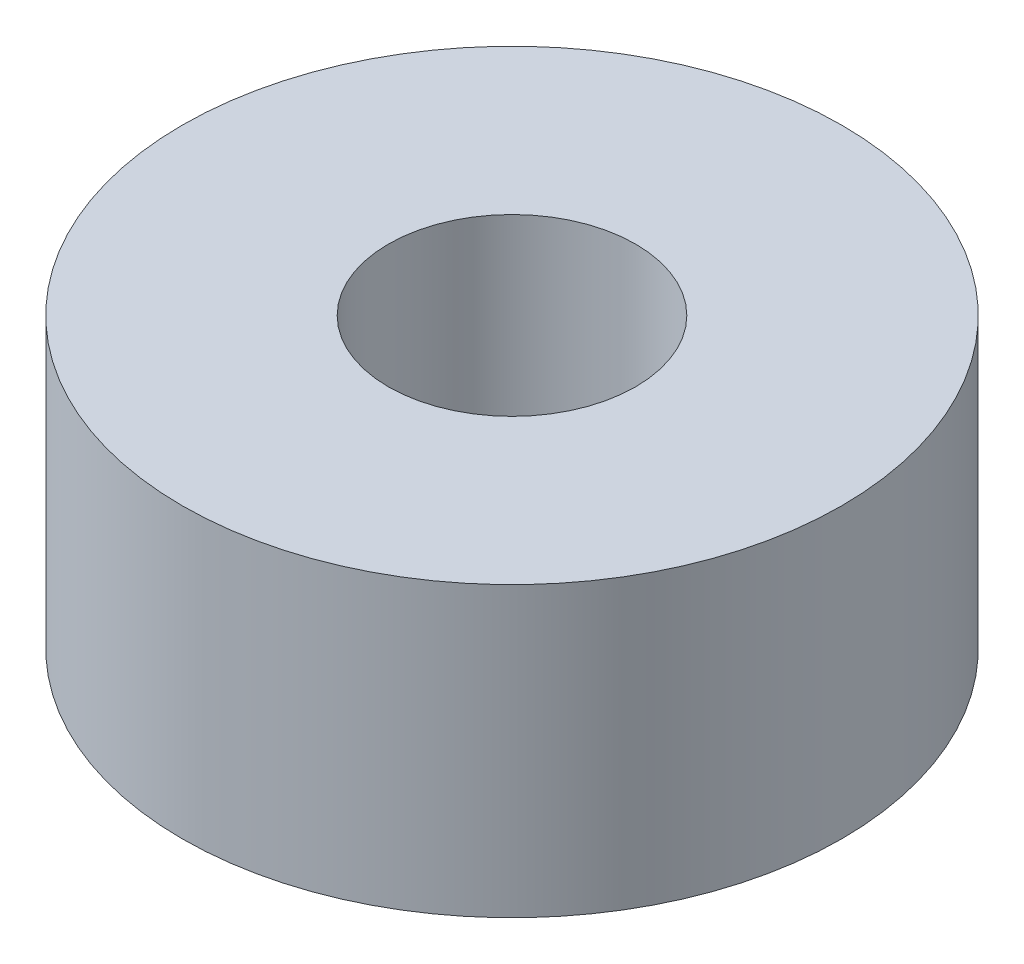
ISO-10303-21;
HEADER;
FILE_DESCRIPTION(('STEP AP214'),'2;1');
FILE_NAME('part.step','',(''),(''),'','','');
FILE_SCHEMA(('AUTOMOTIVE_DESIGN { 1 0 10303 214 1 1 1 1 }'));
ENDSEC;
DATA;
#1=APPLICATION_CONTEXT('core data for automotive mechanical design processes');
#2=APPLICATION_PROTOCOL_DEFINITION('international standard','automotive_design',2000,#1);
#3=PRODUCT_CONTEXT('',#1,'mechanical');
#4=PRODUCT('Part','Part','',(#3));
#5=PRODUCT_RELATED_PRODUCT_CATEGORY('part','',(#4));
#6=PRODUCT_DEFINITION_FORMATION('','',#4);
#7=PRODUCT_DEFINITION_CONTEXT('part definition',#1,'design');
#8=PRODUCT_DEFINITION('design','',#6,#7);
#9=PRODUCT_DEFINITION_SHAPE('','',#8);
#10=(LENGTH_UNIT() NAMED_UNIT(*) SI_UNIT(.MILLI.,.METRE.));
#11=(NAMED_UNIT(*) PLANE_ANGLE_UNIT() SI_UNIT($,.RADIAN.));
#12=(NAMED_UNIT(*) SI_UNIT($,.STERADIAN.) SOLID_ANGLE_UNIT());
#13=UNCERTAINTY_MEASURE_WITH_UNIT(LENGTH_MEASURE(1.E-05),#10,'distance_accuracy_value','');
#14=(GEOMETRIC_REPRESENTATION_CONTEXT(3) GLOBAL_UNCERTAINTY_ASSIGNED_CONTEXT((#13)) GLOBAL_UNIT_ASSIGNED_CONTEXT((#10,
#11,#12)) REPRESENTATION_CONTEXT('',''));
#15=CARTESIAN_POINT('',(0.,0.,0.));
#16=DIRECTION('',(0.,0.,1.));
#17=DIRECTION('',(1.,0.,0.));
#18=AXIS2_PLACEMENT_3D('',#15,#16,#17);
#19=CARTESIAN_POINT('',(0.,3.5,0.));
#20=DIRECTION('',(0.,1.,0.));
#21=DIRECTION('',(0.,0.,1.));
#22=AXIS2_PLACEMENT_3D('',#19,#20,#21);
#23=PLANE('',#22);
#24=CARTESIAN_POINT('',(0.,3.5,0.));
#25=DIRECTION('',(0.,1.,0.));
#26=DIRECTION('',(0.,0.,1.));
#27=AXIS2_PLACEMENT_3D('',#24,#25,#26);
#28=CIRCLE('',#27,4.);
#29=CARTESIAN_POINT('',(0.,3.5,4.));
#30=VERTEX_POINT('',#29);
#31=EDGE_CURVE('E10',#30,#30,#28,.T.);
#32=ORIENTED_EDGE('',*,*,#31,.T.);
#33=EDGE_LOOP('',(#32));
#34=FACE_BOUND('',#33,.T.);
#35=CARTESIAN_POINT('',(0.,3.5,0.));
#36=DIRECTION('',(0.,1.,0.));
#37=DIRECTION('',(0.,0.,1.));
#38=AXIS2_PLACEMENT_3D('',#35,#36,#37);
#39=CIRCLE('',#38,1.5);
#40=CARTESIAN_POINT('',(0.,3.5,1.5));
#41=VERTEX_POINT('',#40);
#42=EDGE_CURVE('E50',#41,#41,#39,.T.);
#43=ORIENTED_EDGE('',*,*,#42,.F.);
#44=EDGE_LOOP('',(#43));
#45=FACE_BOUND('',#44,.T.);
#46=ADVANCED_FACE('F37',(#34,#45),#23,.T.);
#47=CARTESIAN_POINT('',(0.,0.,0.));
#48=DIRECTION('',(0.,1.,0.));
#49=DIRECTION('',(0.,0.,1.));
#50=AXIS2_PLACEMENT_3D('',#47,#48,#49);
#51=PLANE('',#50);
#52=CARTESIAN_POINT('',(0.,0.,0.));
#53=DIRECTION('',(0.,1.,0.));
#54=DIRECTION('',(0.,0.,1.));
#55=AXIS2_PLACEMENT_3D('',#52,#53,#54);
#56=CIRCLE('',#55,4.);
#57=CARTESIAN_POINT('',(0.,0.,4.));
#58=VERTEX_POINT('',#57);
#59=EDGE_CURVE('E41',#58,#58,#56,.T.);
#60=ORIENTED_EDGE('',*,*,#59,.F.);
#61=EDGE_LOOP('',(#60));
#62=FACE_BOUND('',#61,.T.);
#63=CARTESIAN_POINT('',(0.,0.,0.));
#64=DIRECTION('',(0.,1.,0.));
#65=DIRECTION('',(0.,0.,1.));
#66=AXIS2_PLACEMENT_3D('',#63,#64,#65);
#67=CIRCLE('',#66,1.5);
#68=CARTESIAN_POINT('',(0.,0.,1.5));
#69=VERTEX_POINT('',#68);
#70=EDGE_CURVE('E52',#69,#69,#67,.T.);
#71=ORIENTED_EDGE('',*,*,#70,.T.);
#72=EDGE_LOOP('',(#71));
#73=FACE_BOUND('',#72,.T.);
#74=ADVANCED_FACE('F64',(#62,#73),#51,.F.);
#75=CARTESIAN_POINT('',(0.,3.5,0.));
#76=DIRECTION('',(0.,-1.,0.));
#77=DIRECTION('',(0.,0.,-1.));
#78=AXIS2_PLACEMENT_3D('',#75,#76,#77);
#79=CYLINDRICAL_SURFACE('',#78,4.);
#80=ORIENTED_EDGE('',*,*,#31,.F.);
#81=EDGE_LOOP('',(#80));
#82=FACE_BOUND('',#81,.T.);
#83=ORIENTED_EDGE('',*,*,#59,.T.);
#84=EDGE_LOOP('',(#83));
#85=FACE_BOUND('',#84,.T.);
#86=ADVANCED_FACE('F39',(#82,#85),#79,.T.);
#87=CARTESIAN_POINT('',(0.,3.5,0.));
#88=DIRECTION('',(0.,-1.,0.));
#89=DIRECTION('',(0.,0.,-1.));
#90=AXIS2_PLACEMENT_3D('',#87,#88,#89);
#91=CYLINDRICAL_SURFACE('',#90,1.5);
#92=ORIENTED_EDGE('',*,*,#42,.T.);
#93=EDGE_LOOP('',(#92));
#94=FACE_BOUND('',#93,.T.);
#95=ORIENTED_EDGE('',*,*,#70,.F.);
#96=EDGE_LOOP('',(#95));
#97=FACE_BOUND('',#96,.T.);
#98=ADVANCED_FACE('F60',(#94,#97),#91,.F.);
#99=CLOSED_SHELL('',(#46,#74,#86,#98));
#100=MANIFOLD_SOLID_BREP('B2',#99);
#101=ADVANCED_BREP_SHAPE_REPRESENTATION('',(#18,#100),#14);
#102=SHAPE_DEFINITION_REPRESENTATION(#9,#101);
ENDSEC;
END-ISO-10303-21;
